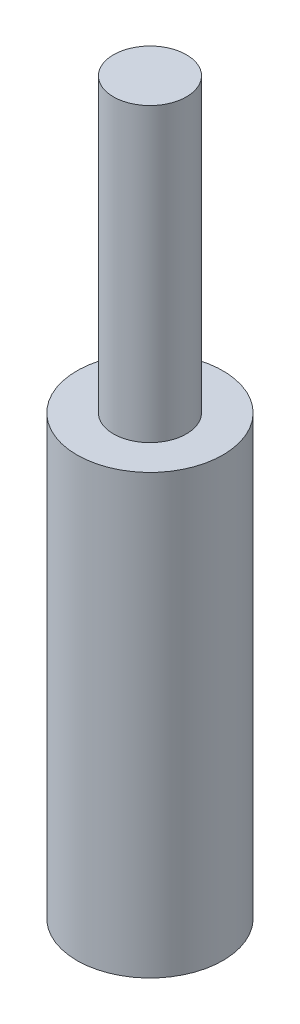
ISO-10303-21;
HEADER;
FILE_DESCRIPTION(('STEP AP214'),'2;1');
FILE_NAME('part.step','',(''),(''),'','','');
FILE_SCHEMA(('AUTOMOTIVE_DESIGN { 1 0 10303 214 1 1 1 1 }'));
ENDSEC;
DATA;
#1=APPLICATION_CONTEXT('core data for automotive mechanical design processes');
#2=APPLICATION_PROTOCOL_DEFINITION('international standard','automotive_design',2000,#1);
#3=PRODUCT_CONTEXT('',#1,'mechanical');
#4=PRODUCT('Part','Part','',(#3));
#5=PRODUCT_RELATED_PRODUCT_CATEGORY('part','',(#4));
#6=PRODUCT_DEFINITION_FORMATION('','',#4);
#7=PRODUCT_DEFINITION_CONTEXT('part definition',#1,'design');
#8=PRODUCT_DEFINITION('design','',#6,#7);
#9=PRODUCT_DEFINITION_SHAPE('','',#8);
#10=(LENGTH_UNIT() NAMED_UNIT(*) SI_UNIT(.MILLI.,.METRE.));
#11=(NAMED_UNIT(*) PLANE_ANGLE_UNIT() SI_UNIT($,.RADIAN.));
#12=(NAMED_UNIT(*) SI_UNIT($,.STERADIAN.) SOLID_ANGLE_UNIT());
#13=UNCERTAINTY_MEASURE_WITH_UNIT(LENGTH_MEASURE(1.E-05),#10,'distance_accuracy_value','');
#14=(GEOMETRIC_REPRESENTATION_CONTEXT(3) GLOBAL_UNCERTAINTY_ASSIGNED_CONTEXT((#13)) GLOBAL_UNIT_ASSIGNED_CONTEXT((#10,
#11,#12)) REPRESENTATION_CONTEXT('',''));
#15=CARTESIAN_POINT('',(0.,0.,0.));
#16=DIRECTION('',(0.,0.,1.));
#17=DIRECTION('',(1.,0.,0.));
#18=AXIS2_PLACEMENT_3D('',#15,#16,#17);
#19=CARTESIAN_POINT('',(0.,6.,0.));
#20=DIRECTION('',(0.,-1.,0.));
#21=DIRECTION('',(0.,0.,-1.));
#22=AXIS2_PLACEMENT_3D('',#19,#20,#21);
#23=CYLINDRICAL_SURFACE('',#22,1.);
#24=CARTESIAN_POINT('',(0.,6.,0.));
#25=DIRECTION('',(0.,1.,0.));
#26=DIRECTION('',(0.,0.,1.));
#27=AXIS2_PLACEMENT_3D('',#24,#25,#26);
#28=CIRCLE('',#27,1.);
#29=CARTESIAN_POINT('',(0.,6.,1.));
#30=VERTEX_POINT('',#29);
#31=EDGE_CURVE('E10',#30,#30,#28,.T.);
#32=ORIENTED_EDGE('',*,*,#31,.F.);
#33=EDGE_LOOP('',(#32));
#34=FACE_BOUND('',#33,.T.);
#35=CARTESIAN_POINT('',(0.,0.,0.));
#36=DIRECTION('',(0.,1.,0.));
#37=DIRECTION('',(0.,0.,1.));
#38=AXIS2_PLACEMENT_3D('',#35,#36,#37);
#39=CIRCLE('',#38,1.);
#40=CARTESIAN_POINT('',(0.,0.,1.));
#41=VERTEX_POINT('',#40);
#42=EDGE_CURVE('E34',#41,#41,#39,.T.);
#43=ORIENTED_EDGE('',*,*,#42,.T.);
#44=EDGE_LOOP('',(#43));
#45=FACE_BOUND('',#44,.T.);
#46=ADVANCED_FACE('F31',(#34,#45),#23,.T.);
#47=CARTESIAN_POINT('',(0.,6.,0.));
#48=DIRECTION('',(0.,1.,0.));
#49=DIRECTION('',(0.,0.,1.));
#50=AXIS2_PLACEMENT_3D('',#47,#48,#49);
#51=PLANE('',#50);
#52=CARTESIAN_POINT('',(0.,6.,0.));
#53=DIRECTION('',(0.,1.,0.));
#54=DIRECTION('',(0.,0.,1.));
#55=AXIS2_PLACEMENT_3D('',#52,#53,#54);
#56=CIRCLE('',#55,0.5);
#57=CARTESIAN_POINT('',(0.,6.,0.5));
#58=VERTEX_POINT('',#57);
#59=EDGE_CURVE('E43',#58,#58,#56,.T.);
#60=ORIENTED_EDGE('',*,*,#59,.F.);
#61=EDGE_LOOP('',(#60));
#62=FACE_BOUND('',#61,.T.);
#63=ORIENTED_EDGE('',*,*,#31,.T.);
#64=EDGE_LOOP('',(#63));
#65=FACE_BOUND('',#64,.T.);
#66=ADVANCED_FACE('F58',(#62,#65),#51,.T.);
#67=CARTESIAN_POINT('',(0.,0.,0.));
#68=DIRECTION('',(0.,1.,0.));
#69=DIRECTION('',(0.,0.,1.));
#70=AXIS2_PLACEMENT_3D('',#67,#68,#69);
#71=PLANE('',#70);
#72=ORIENTED_EDGE('',*,*,#42,.F.);
#73=EDGE_LOOP('',(#72));
#74=FACE_BOUND('',#73,.T.);
#75=ADVANCED_FACE('F54',(#74),#71,.F.);
#76=CARTESIAN_POINT('',(0.,10.,0.));
#77=DIRECTION('',(0.,-1.,0.));
#78=DIRECTION('',(0.,0.,-1.));
#79=AXIS2_PLACEMENT_3D('',#76,#77,#78);
#80=CYLINDRICAL_SURFACE('',#79,0.5);
#81=CARTESIAN_POINT('',(0.,10.,0.));
#82=DIRECTION('',(0.,1.,0.));
#83=DIRECTION('',(0.,0.,1.));
#84=AXIS2_PLACEMENT_3D('',#81,#82,#83);
#85=CIRCLE('',#84,0.5);
#86=CARTESIAN_POINT('',(0.,10.,0.5));
#87=VERTEX_POINT('',#86);
#88=EDGE_CURVE('E41',#87,#87,#85,.T.);
#89=ORIENTED_EDGE('',*,*,#88,.F.);
#90=EDGE_LOOP('',(#89));
#91=FACE_BOUND('',#90,.T.);
#92=ORIENTED_EDGE('',*,*,#59,.T.);
#93=EDGE_LOOP('',(#92));
#94=FACE_BOUND('',#93,.T.);
#95=ADVANCED_FACE('F51',(#91,#94),#80,.T.);
#96=CARTESIAN_POINT('',(0.,10.,0.));
#97=DIRECTION('',(0.,1.,0.));
#98=DIRECTION('',(0.,0.,1.));
#99=AXIS2_PLACEMENT_3D('',#96,#97,#98);
#100=PLANE('',#99);
#101=ORIENTED_EDGE('',*,*,#88,.T.);
#102=EDGE_LOOP('',(#101));
#103=FACE_BOUND('',#102,.T.);
#104=ADVANCED_FACE('F49',(#103),#100,.T.);
#105=CLOSED_SHELL('',(#46,#66,#75,#95,#104));
#106=MANIFOLD_SOLID_BREP('B2',#105);
#107=ADVANCED_BREP_SHAPE_REPRESENTATION('',(#18,#106),#14);
#108=SHAPE_DEFINITION_REPRESENTATION(#9,#107);
ENDSEC;
END-ISO-10303-21;
